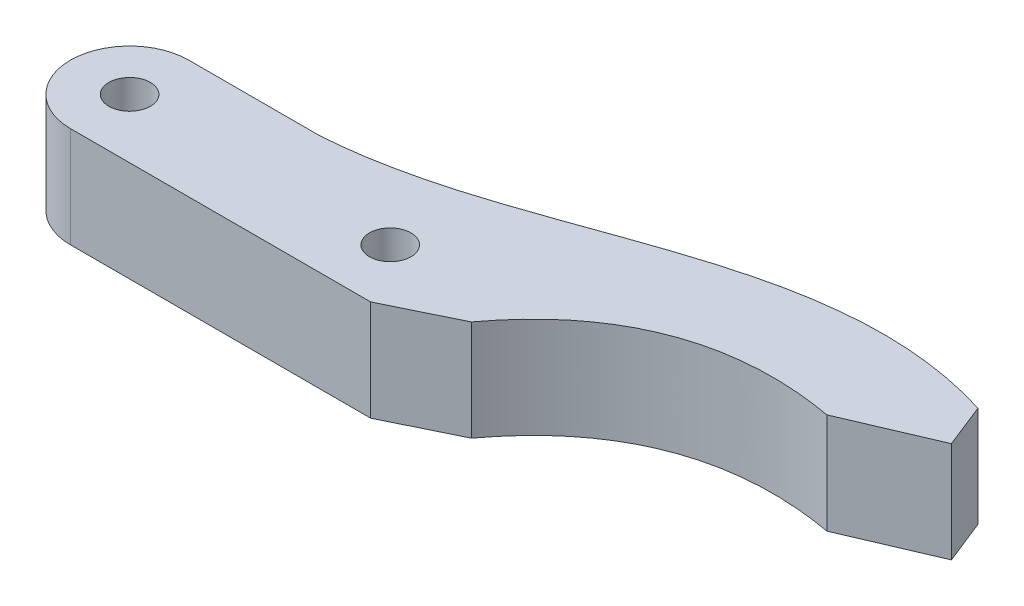
ISO-10303-21;
HEADER;
FILE_DESCRIPTION(('STEP AP214'),'2;1');
FILE_NAME('part.step','',(''),(''),'','','');
FILE_SCHEMA(('AUTOMOTIVE_DESIGN { 1 0 10303 214 1 1 1 1 }'));
ENDSEC;
DATA;
#1=APPLICATION_CONTEXT('core data for automotive mechanical design processes');
#2=APPLICATION_PROTOCOL_DEFINITION('international standard','automotive_design',2000,#1);
#3=PRODUCT_CONTEXT('',#1,'mechanical');
#4=PRODUCT('Part','Part','',(#3));
#5=PRODUCT_RELATED_PRODUCT_CATEGORY('part','',(#4));
#6=PRODUCT_DEFINITION_FORMATION('','',#4);
#7=PRODUCT_DEFINITION_CONTEXT('part definition',#1,'design');
#8=PRODUCT_DEFINITION('design','',#6,#7);
#9=PRODUCT_DEFINITION_SHAPE('','',#8);
#10=(LENGTH_UNIT() NAMED_UNIT(*) SI_UNIT(.MILLI.,.METRE.));
#11=(NAMED_UNIT(*) PLANE_ANGLE_UNIT() SI_UNIT($,.RADIAN.));
#12=(NAMED_UNIT(*) SI_UNIT($,.STERADIAN.) SOLID_ANGLE_UNIT());
#13=UNCERTAINTY_MEASURE_WITH_UNIT(LENGTH_MEASURE(1.E-05),#10,'distance_accuracy_value','');
#14=(GEOMETRIC_REPRESENTATION_CONTEXT(3) GLOBAL_UNCERTAINTY_ASSIGNED_CONTEXT((#13)) GLOBAL_UNIT_ASSIGNED_CONTEXT((#10,
#11,#12)) REPRESENTATION_CONTEXT('',''));
#15=CARTESIAN_POINT('',(0.,0.,0.));
#16=DIRECTION('',(0.,0.,1.));
#17=DIRECTION('',(1.,0.,0.));
#18=AXIS2_PLACEMENT_3D('',#15,#16,#17);
#19=CARTESIAN_POINT('',(0.,8.5,5.));
#20=DIRECTION('',(0.,0.,-1.));
#21=DIRECTION('',(-1.,0.,0.));
#22=AXIS2_PLACEMENT_3D('',#19,#20,#21);
#23=PLANE('',#22);
#24=DIRECTION('',(1.,0.,0.));
#25=VECTOR('',#24,1.);
#26=CARTESIAN_POINT('',(0.,0.,5.));
#27=LINE('',#26,#25);
#28=CARTESIAN_POINT('',(0.,0.,5.));
#29=VERTEX_POINT('',#28);
#30=CARTESIAN_POINT('',(25.3464005716717,0.,5.));
#31=VERTEX_POINT('',#30);
#32=EDGE_CURVE('E157',#29,#31,#27,.T.);
#33=ORIENTED_EDGE('',*,*,#32,.T.);
#34=DIRECTION('',(0.,1.,0.));
#35=VECTOR('',#34,1.);
#36=CARTESIAN_POINT('',(25.3464005716717,0.,5.));
#37=LINE('',#36,#35);
#38=CARTESIAN_POINT('',(25.3464005716717,8.5,5.));
#39=VERTEX_POINT('',#38);
#40=EDGE_CURVE('E206',#31,#39,#37,.T.);
#41=ORIENTED_EDGE('',*,*,#40,.T.);
#42=DIRECTION('',(1.,0.,0.));
#43=VECTOR('',#42,1.);
#44=CARTESIAN_POINT('',(0.,8.5,5.));
#45=LINE('',#44,#43);
#46=CARTESIAN_POINT('',(0.,8.5,5.));
#47=VERTEX_POINT('',#46);
#48=EDGE_CURVE('E169',#47,#39,#45,.T.);
#49=ORIENTED_EDGE('',*,*,#48,.F.);
#50=DIRECTION('',(0.,-1.,0.));
#51=VECTOR('',#50,1.);
#52=CARTESIAN_POINT('',(0.,8.5,5.));
#53=LINE('',#52,#51);
#54=EDGE_CURVE('E118',#47,#29,#53,.T.);
#55=ORIENTED_EDGE('',*,*,#54,.T.);
#56=EDGE_LOOP('',(#33,#41,#49,#55));
#57=FACE_BOUND('',#56,.T.);
#58=ADVANCED_FACE('F112',(#57),#23,.F.);
#59=CARTESIAN_POINT('',(0.,8.5,-5.));
#60=DIRECTION('',(0.,0.,-1.));
#61=DIRECTION('',(-1.,0.,0.));
#62=AXIS2_PLACEMENT_3D('',#59,#60,#61);
#63=PLANE('',#62);
#64=DIRECTION('',(0.,1.,0.));
#65=VECTOR('',#64,1.);
#66=CARTESIAN_POINT('',(11.,0.,-5.));
#67=LINE('',#66,#65);
#68=CARTESIAN_POINT('',(11.,0.,-5.));
#69=VERTEX_POINT('',#68);
#70=CARTESIAN_POINT('',(11.,8.5,-5.));
#71=VERTEX_POINT('',#70);
#72=EDGE_CURVE('E126',#69,#71,#67,.T.);
#73=ORIENTED_EDGE('',*,*,#72,.F.);
#74=DIRECTION('',(1.,0.,0.));
#75=VECTOR('',#74,1.);
#76=CARTESIAN_POINT('',(0.,0.,-5.));
#77=LINE('',#76,#75);
#78=CARTESIAN_POINT('',(0.,0.,-5.));
#79=VERTEX_POINT('',#78);
#80=EDGE_CURVE('E154',#79,#69,#77,.T.);
#81=ORIENTED_EDGE('',*,*,#80,.F.);
#82=DIRECTION('',(0.,-1.,0.));
#83=VECTOR('',#82,1.);
#84=CARTESIAN_POINT('',(0.,8.5,-5.));
#85=LINE('',#84,#83);
#86=CARTESIAN_POINT('',(0.,8.5,-5.));
#87=VERTEX_POINT('',#86);
#88=EDGE_CURVE('E12',#87,#79,#85,.T.);
#89=ORIENTED_EDGE('',*,*,#88,.F.);
#90=DIRECTION('',(1.,0.,0.));
#91=VECTOR('',#90,1.);
#92=CARTESIAN_POINT('',(0.,8.5,-5.));
#93=LINE('',#92,#91);
#94=EDGE_CURVE('E163',#87,#71,#93,.T.);
#95=ORIENTED_EDGE('',*,*,#94,.T.);
#96=EDGE_LOOP('',(#73,#81,#89,#95));
#97=FACE_BOUND('',#96,.T.);
#98=ADVANCED_FACE('F165',(#97),#63,.T.);
#99=CARTESIAN_POINT('',(22.,0.,0.));
#100=DIRECTION('',(0.,1.,0.));
#101=DIRECTION('',(0.,0.,1.));
#102=AXIS2_PLACEMENT_3D('',#99,#100,#101);
#103=PLANE('',#102);
#104=ORIENTED_EDGE('',*,*,#80,.T.);
#105=CARTESIAN_POINT('',(58.75,0.,-12.87));
#106=CARTESIAN_POINT('',(40.764199152575,0.,-18.4266682126731));
#107=CARTESIAN_POINT('',(27.5435853267951,0.,-6.0573623183777));
#108=CARTESIAN_POINT('',(11.,0.,-5.));
#109=B_SPLINE_CURVE_WITH_KNOTS('',3,(#105,#106,#107,#108),.UNSPECIFIED.,.F.,.F.,(4,4),(0.,1.),.UNSPECIFIED.);
#110=CARTESIAN_POINT('',(58.75,0.,-12.87));
#111=VERTEX_POINT('',#110);
#112=EDGE_CURVE('E208',#111,#69,#109,.T.);
#113=ORIENTED_EDGE('',*,*,#112,.F.);
#114=DIRECTION('',(-0.368119096149352,0.,-0.929778646264897));
#115=VECTOR('',#114,1.);
#116=CARTESIAN_POINT('',(58.75,0.,-12.87));
#117=LINE('',#116,#115);
#118=CARTESIAN_POINT('',(60.2224763845974,0.,-9.15088541494041));
#119=VERTEX_POINT('',#118);
#120=EDGE_CURVE('E386',#119,#111,#117,.T.);
#121=ORIENTED_EDGE('',*,*,#120,.F.);
#122=DIRECTION('',(0.919170151396048,0.,-0.393860676867551));
#123=VECTOR('',#122,1.);
#124=CARTESIAN_POINT('',(60.2224763845974,0.,-9.15088541494041));
#125=LINE('',#124,#123);
#126=CARTESIAN_POINT('',(52.869115173429,0.,-6.));
#127=VERTEX_POINT('',#126);
#128=EDGE_CURVE('E255',#127,#119,#125,.T.);
#129=ORIENTED_EDGE('',*,*,#128,.F.);
#130=CARTESIAN_POINT('',(31.0617578447506,0.,2.2124340026225));
#131=CARTESIAN_POINT('',(38.9927579348476,0.,-8.50475736994109));
#132=CARTESIAN_POINT('',(52.869115173429,0.,-6.));
#133=B_SPLINE_CURVE_WITH_KNOTS('',2,(#130,#131,#132),.UNSPECIFIED.,.F.,.F.,(3,3),(0.,1.),.UNSPECIFIED.);
#134=CARTESIAN_POINT('',(31.0617578447506,0.,2.2124340026225));
#135=VERTEX_POINT('',#134);
#136=EDGE_CURVE('E247',#135,#127,#133,.T.);
#137=ORIENTED_EDGE('',*,*,#136,.F.);
#138=DIRECTION('',(0.898794046299166,0.,-0.438371146789079));
#139=VECTOR('',#138,1.);
#140=CARTESIAN_POINT('',(25.3464005716717,0.,5.));
#141=LINE('',#140,#139);
#142=EDGE_CURVE('E248',#31,#135,#141,.T.);
#143=ORIENTED_EDGE('',*,*,#142,.F.);
#144=ORIENTED_EDGE('',*,*,#32,.F.);
#145=CARTESIAN_POINT('',(0.,0.,0.));
#146=DIRECTION('',(0.,1.,0.));
#147=DIRECTION('',(0.,0.,1.));
#148=AXIS2_PLACEMENT_3D('',#145,#146,#147);
#149=CIRCLE('',#148,5.);
#150=EDGE_CURVE('E148',#79,#29,#149,.T.);
#151=ORIENTED_EDGE('',*,*,#150,.F.);
#152=EDGE_LOOP('',(#104,#113,#121,#129,#137,#143,#144,#151));
#153=FACE_BOUND('',#152,.T.);
#154=CARTESIAN_POINT('',(0.,0.,0.));
#155=DIRECTION('',(0.,1.,0.));
#156=DIRECTION('',(0.,0.,1.));
#157=AXIS2_PLACEMENT_3D('',#154,#155,#156);
#158=CIRCLE('',#157,1.75);
#159=CARTESIAN_POINT('',(0.,0.,1.75));
#160=VERTEX_POINT('',#159);
#161=EDGE_CURVE('E171',#160,#160,#158,.T.);
#162=ORIENTED_EDGE('',*,*,#161,.T.);
#163=EDGE_LOOP('',(#162));
#164=FACE_BOUND('',#163,.T.);
#165=CARTESIAN_POINT('',(22.,0.,0.));
#166=DIRECTION('',(0.,1.,0.));
#167=DIRECTION('',(0.,0.,1.));
#168=AXIS2_PLACEMENT_3D('',#165,#166,#167);
#169=CIRCLE('',#168,1.75);
#170=CARTESIAN_POINT('',(22.,0.,1.75));
#171=VERTEX_POINT('',#170);
#172=EDGE_CURVE('E113',#171,#171,#169,.T.);
#173=ORIENTED_EDGE('',*,*,#172,.T.);
#174=EDGE_LOOP('',(#173));
#175=FACE_BOUND('',#174,.T.);
#176=ADVANCED_FACE('F155',(#153,#164,#175),#103,.F.);
#177=CARTESIAN_POINT('',(22.,8.5,0.));
#178=DIRECTION('',(0.,1.,0.));
#179=DIRECTION('',(0.,0.,1.));
#180=AXIS2_PLACEMENT_3D('',#177,#178,#179);
#181=PLANE('',#180);
#182=ORIENTED_EDGE('',*,*,#94,.F.);
#183=CARTESIAN_POINT('',(0.,8.5,0.));
#184=DIRECTION('',(0.,1.,0.));
#185=DIRECTION('',(0.,0.,1.));
#186=AXIS2_PLACEMENT_3D('',#183,#184,#185);
#187=CIRCLE('',#186,5.);
#188=EDGE_CURVE('E149',#87,#47,#187,.T.);
#189=ORIENTED_EDGE('',*,*,#188,.T.);
#190=ORIENTED_EDGE('',*,*,#48,.T.);
#191=DIRECTION('',(0.898794046299166,0.,-0.438371146789079));
#192=VECTOR('',#191,1.);
#193=CARTESIAN_POINT('',(25.3464005716717,8.5,5.));
#194=LINE('',#193,#192);
#195=CARTESIAN_POINT('',(31.0617578447506,8.5,2.2124340026225));
#196=VERTEX_POINT('',#195);
#197=EDGE_CURVE('E218',#39,#196,#194,.T.);
#198=ORIENTED_EDGE('',*,*,#197,.T.);
#199=CARTESIAN_POINT('',(31.0617578447506,8.5,2.2124340026225));
#200=CARTESIAN_POINT('',(38.9927579348476,8.5,-8.50475736994109));
#201=CARTESIAN_POINT('',(52.869115173429,8.5,-6.));
#202=B_SPLINE_CURVE_WITH_KNOTS('',2,(#199,#200,#201),.UNSPECIFIED.,.F.,.F.,(3,3),(0.,1.),.UNSPECIFIED.);
#203=CARTESIAN_POINT('',(52.869115173429,8.5,-6.));
#204=VERTEX_POINT('',#203);
#205=EDGE_CURVE('E226',#196,#204,#202,.T.);
#206=ORIENTED_EDGE('',*,*,#205,.T.);
#207=DIRECTION('',(0.919170151396048,0.,-0.393860676867551));
#208=VECTOR('',#207,1.);
#209=CARTESIAN_POINT('',(60.2224763845974,8.5,-9.15088541494041));
#210=LINE('',#209,#208);
#211=CARTESIAN_POINT('',(60.2224763845974,8.5,-9.15088541494041));
#212=VERTEX_POINT('',#211);
#213=EDGE_CURVE('E234',#204,#212,#210,.T.);
#214=ORIENTED_EDGE('',*,*,#213,.T.);
#215=DIRECTION('',(-0.368119096149352,0.,-0.929778646264897));
#216=VECTOR('',#215,1.);
#217=CARTESIAN_POINT('',(58.75,8.5,-12.87));
#218=LINE('',#217,#216);
#219=CARTESIAN_POINT('',(58.75,8.5,-12.87));
#220=VERTEX_POINT('',#219);
#221=EDGE_CURVE('E243',#212,#220,#218,.T.);
#222=ORIENTED_EDGE('',*,*,#221,.T.);
#223=CARTESIAN_POINT('',(58.75,8.5,-12.87));
#224=CARTESIAN_POINT('',(40.764199152575,8.5,-18.4266682126731));
#225=CARTESIAN_POINT('',(27.5435853267951,8.5,-6.0573623183777));
#226=CARTESIAN_POINT('',(11.,8.5,-5.));
#227=B_SPLINE_CURVE_WITH_KNOTS('',3,(#223,#224,#225,#226),.UNSPECIFIED.,.F.,.F.,(4,4),(0.,1.),.UNSPECIFIED.);
#228=EDGE_CURVE('E195',#220,#71,#227,.T.);
#229=ORIENTED_EDGE('',*,*,#228,.T.);
#230=EDGE_LOOP('',(#182,#189,#190,#198,#206,#214,#222,#229));
#231=FACE_BOUND('',#230,.T.);
#232=CARTESIAN_POINT('',(0.,8.5,0.));
#233=DIRECTION('',(0.,1.,0.));
#234=DIRECTION('',(0.,0.,1.));
#235=AXIS2_PLACEMENT_3D('',#232,#233,#234);
#236=CIRCLE('',#235,1.75);
#237=CARTESIAN_POINT('',(0.,8.5,1.75));
#238=VERTEX_POINT('',#237);
#239=EDGE_CURVE('E159',#238,#238,#236,.T.);
#240=ORIENTED_EDGE('',*,*,#239,.F.);
#241=EDGE_LOOP('',(#240));
#242=FACE_BOUND('',#241,.T.);
#243=CARTESIAN_POINT('',(22.,8.5,0.));
#244=DIRECTION('',(0.,1.,0.));
#245=DIRECTION('',(0.,0.,1.));
#246=AXIS2_PLACEMENT_3D('',#243,#244,#245);
#247=CIRCLE('',#246,1.75);
#248=CARTESIAN_POINT('',(22.,8.5,1.75));
#249=VERTEX_POINT('',#248);
#250=EDGE_CURVE('E179',#249,#249,#247,.T.);
#251=ORIENTED_EDGE('',*,*,#250,.F.);
#252=EDGE_LOOP('',(#251));
#253=FACE_BOUND('',#252,.T.);
#254=ADVANCED_FACE('F212',(#231,#242,#253),#181,.T.);
#255=CARTESIAN_POINT('',(22.,8.5,0.));
#256=DIRECTION('',(0.,-1.,0.));
#257=DIRECTION('',(0.,0.,-1.));
#258=AXIS2_PLACEMENT_3D('',#255,#256,#257);
#259=CYLINDRICAL_SURFACE('',#258,1.75);
#260=ORIENTED_EDGE('',*,*,#250,.T.);
#261=EDGE_LOOP('',(#260));
#262=FACE_BOUND('',#261,.T.);
#263=ORIENTED_EDGE('',*,*,#172,.F.);
#264=EDGE_LOOP('',(#263));
#265=FACE_BOUND('',#264,.T.);
#266=ADVANCED_FACE('F114',(#262,#265),#259,.F.);
#267=CARTESIAN_POINT('',(0.,8.5,0.));
#268=DIRECTION('',(0.,-1.,0.));
#269=DIRECTION('',(0.,0.,-1.));
#270=AXIS2_PLACEMENT_3D('',#267,#268,#269);
#271=CYLINDRICAL_SURFACE('',#270,1.75);
#272=ORIENTED_EDGE('',*,*,#239,.T.);
#273=EDGE_LOOP('',(#272));
#274=FACE_BOUND('',#273,.T.);
#275=ORIENTED_EDGE('',*,*,#161,.F.);
#276=EDGE_LOOP('',(#275));
#277=FACE_BOUND('',#276,.T.);
#278=ADVANCED_FACE('F282',(#274,#277),#271,.F.);
#279=CARTESIAN_POINT('',(0.,8.5,0.));
#280=DIRECTION('',(0.,-1.,0.));
#281=DIRECTION('',(0.,0.,-1.));
#282=AXIS2_PLACEMENT_3D('',#279,#280,#281);
#283=CYLINDRICAL_SURFACE('',#282,5.);
#284=ORIENTED_EDGE('',*,*,#188,.F.);
#285=ORIENTED_EDGE('',*,*,#88,.T.);
#286=ORIENTED_EDGE('',*,*,#150,.T.);
#287=ORIENTED_EDGE('',*,*,#54,.F.);
#288=EDGE_LOOP('',(#284,#285,#286,#287));
#289=FACE_BOUND('',#288,.T.);
#290=ADVANCED_FACE('F144',(#289),#283,.T.);
#291=DIRECTION('',(0.,1.,0.));
#292=VECTOR('',#291,1.);
#293=SURFACE_OF_LINEAR_EXTRUSION('',#109,#292);
#294=ORIENTED_EDGE('',*,*,#228,.F.);
#295=DIRECTION('',(0.,1.,0.));
#296=VECTOR('',#295,1.);
#297=CARTESIAN_POINT('',(58.75,0.,-12.87));
#298=LINE('',#297,#296);
#299=EDGE_CURVE('E181',#111,#220,#298,.T.);
#300=ORIENTED_EDGE('',*,*,#299,.F.);
#301=ORIENTED_EDGE('',*,*,#112,.T.);
#302=ORIENTED_EDGE('',*,*,#72,.T.);
#303=EDGE_LOOP('',(#294,#300,#301,#302));
#304=FACE_BOUND('',#303,.T.);
#305=ADVANCED_FACE('F281',(#304),#293,.T.);
#306=CARTESIAN_POINT('',(58.75,0.,-12.87));
#307=DIRECTION('',(0.929778646264897,0.,-0.368119096149352));
#308=DIRECTION('',(-0.368119096149352,0.,-0.929778646264897));
#309=AXIS2_PLACEMENT_3D('',#306,#307,#308);
#310=PLANE('',#309);
#311=ORIENTED_EDGE('',*,*,#221,.F.);
#312=DIRECTION('',(0.,1.,0.));
#313=VECTOR('',#312,1.);
#314=CARTESIAN_POINT('',(60.2224763845974,0.,-9.15088541494041));
#315=LINE('',#314,#313);
#316=EDGE_CURVE('E188',#119,#212,#315,.T.);
#317=ORIENTED_EDGE('',*,*,#316,.F.);
#318=ORIENTED_EDGE('',*,*,#120,.T.);
#319=ORIENTED_EDGE('',*,*,#299,.T.);
#320=EDGE_LOOP('',(#311,#317,#318,#319));
#321=FACE_BOUND('',#320,.T.);
#322=ADVANCED_FACE('F288',(#321),#310,.T.);
#323=CARTESIAN_POINT('',(60.2224763845974,0.,-9.15088541494041));
#324=DIRECTION('',(0.393860676867551,0.,0.919170151396048));
#325=DIRECTION('',(0.919170151396048,0.,-0.393860676867552));
#326=AXIS2_PLACEMENT_3D('',#323,#324,#325);
#327=PLANE('',#326);
#328=ORIENTED_EDGE('',*,*,#213,.F.);
#329=DIRECTION('',(0.,1.,0.));
#330=VECTOR('',#329,1.);
#331=CARTESIAN_POINT('',(52.869115173429,0.,-6.));
#332=LINE('',#331,#330);
#333=EDGE_CURVE('E199',#127,#204,#332,.T.);
#334=ORIENTED_EDGE('',*,*,#333,.F.);
#335=ORIENTED_EDGE('',*,*,#128,.T.);
#336=ORIENTED_EDGE('',*,*,#316,.T.);
#337=EDGE_LOOP('',(#328,#334,#335,#336));
#338=FACE_BOUND('',#337,.T.);
#339=ADVANCED_FACE('F268',(#338),#327,.T.);
#340=DIRECTION('',(0.,1.,0.));
#341=VECTOR('',#340,1.);
#342=SURFACE_OF_LINEAR_EXTRUSION('',#133,#341);
#343=ORIENTED_EDGE('',*,*,#205,.F.);
#344=DIRECTION('',(0.,1.,0.));
#345=VECTOR('',#344,1.);
#346=CARTESIAN_POINT('',(31.0617578447506,0.,2.2124340026225));
#347=LINE('',#346,#345);
#348=EDGE_CURVE('E201',#135,#196,#347,.T.);
#349=ORIENTED_EDGE('',*,*,#348,.F.);
#350=ORIENTED_EDGE('',*,*,#136,.T.);
#351=ORIENTED_EDGE('',*,*,#333,.T.);
#352=EDGE_LOOP('',(#343,#349,#350,#351));
#353=FACE_BOUND('',#352,.T.);
#354=ADVANCED_FACE('F262',(#353),#342,.T.);
#355=CARTESIAN_POINT('',(25.3464005716717,0.,5.));
#356=DIRECTION('',(0.438371146789079,0.,0.898794046299166));
#357=DIRECTION('',(0.898794046299166,0.,-0.438371146789079));
#358=AXIS2_PLACEMENT_3D('',#355,#356,#357);
#359=PLANE('',#358);
#360=ORIENTED_EDGE('',*,*,#197,.F.);
#361=ORIENTED_EDGE('',*,*,#40,.F.);
#362=ORIENTED_EDGE('',*,*,#142,.T.);
#363=ORIENTED_EDGE('',*,*,#348,.T.);
#364=EDGE_LOOP('',(#360,#361,#362,#363));
#365=FACE_BOUND('',#364,.T.);
#366=ADVANCED_FACE('F227',(#365),#359,.T.);
#367=CLOSED_SHELL('',(#58,#98,#176,#254,#266,#278,#290,#305,#322,#339,#354,#366));
#368=MANIFOLD_SOLID_BREP('B2',#367);
#369=ADVANCED_BREP_SHAPE_REPRESENTATION('',(#18,#368),#14);
#370=SHAPE_DEFINITION_REPRESENTATION(#9,#369);
ENDSEC;
END-ISO-10303-21;
